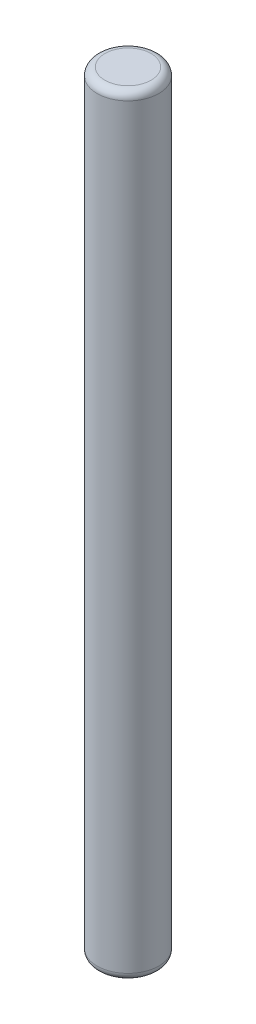
ISO-10303-21;
HEADER;
FILE_DESCRIPTION(('STEP AP214'),'2;1');
FILE_NAME('part.step','',(''),(''),'','','');
FILE_SCHEMA(('AUTOMOTIVE_DESIGN { 1 0 10303 214 1 1 1 1 }'));
ENDSEC;
DATA;
#1=APPLICATION_CONTEXT('core data for automotive mechanical design processes');
#2=APPLICATION_PROTOCOL_DEFINITION('international standard','automotive_design',2000,#1);
#3=PRODUCT_CONTEXT('',#1,'mechanical');
#4=PRODUCT('Part','Part','',(#3));
#5=PRODUCT_RELATED_PRODUCT_CATEGORY('part','',(#4));
#6=PRODUCT_DEFINITION_FORMATION('','',#4);
#7=PRODUCT_DEFINITION_CONTEXT('part definition',#1,'design');
#8=PRODUCT_DEFINITION('design','',#6,#7);
#9=PRODUCT_DEFINITION_SHAPE('','',#8);
#10=(LENGTH_UNIT() NAMED_UNIT(*) SI_UNIT(.MILLI.,.METRE.));
#11=(NAMED_UNIT(*) PLANE_ANGLE_UNIT() SI_UNIT($,.RADIAN.));
#12=(NAMED_UNIT(*) SI_UNIT($,.STERADIAN.) SOLID_ANGLE_UNIT());
#13=UNCERTAINTY_MEASURE_WITH_UNIT(LENGTH_MEASURE(1.E-05),#10,'distance_accuracy_value','');
#14=(GEOMETRIC_REPRESENTATION_CONTEXT(3) GLOBAL_UNCERTAINTY_ASSIGNED_CONTEXT((#13)) GLOBAL_UNIT_ASSIGNED_CONTEXT((#10,
#11,#12)) REPRESENTATION_CONTEXT('',''));
#15=CARTESIAN_POINT('',(0.,0.,0.));
#16=DIRECTION('',(0.,0.,1.));
#17=DIRECTION('',(1.,0.,0.));
#18=AXIS2_PLACEMENT_3D('',#15,#16,#17);
#19=CARTESIAN_POINT('',(0.,50.,0.));
#20=DIRECTION('',(0.,-1.,0.));
#21=DIRECTION('',(0.,0.,-1.));
#22=AXIS2_PLACEMENT_3D('',#19,#20,#21);
#23=CYLINDRICAL_SURFACE('',#22,2.);
#24=CARTESIAN_POINT('',(0.,0.5,0.));
#25=DIRECTION('',(0.,1.,0.));
#26=DIRECTION('',(0.,0.,1.));
#27=AXIS2_PLACEMENT_3D('',#24,#25,#26);
#28=CIRCLE('',#27,2.);
#29=CARTESIAN_POINT('',(0.,0.5,2.));
#30=VERTEX_POINT('',#29);
#31=EDGE_CURVE('E48',#30,#30,#28,.T.);
#32=ORIENTED_EDGE('',*,*,#31,.T.);
#33=EDGE_LOOP('',(#32));
#34=FACE_BOUND('',#33,.T.);
#35=CARTESIAN_POINT('',(0.,49.5,0.));
#36=DIRECTION('',(0.,1.,0.));
#37=DIRECTION('',(0.,0.,1.));
#38=AXIS2_PLACEMENT_3D('',#35,#36,#37);
#39=CIRCLE('',#38,2.);
#40=CARTESIAN_POINT('',(0.,49.5,2.));
#41=VERTEX_POINT('',#40);
#42=EDGE_CURVE('E52',#41,#41,#39,.F.);
#43=ORIENTED_EDGE('',*,*,#42,.T.);
#44=EDGE_LOOP('',(#43));
#45=FACE_BOUND('',#44,.T.);
#46=ADVANCED_FACE('F37',(#34,#45),#23,.T.);
#47=CARTESIAN_POINT('',(0.,50.,0.));
#48=DIRECTION('',(0.,1.,0.));
#49=DIRECTION('',(0.,0.,1.));
#50=AXIS2_PLACEMENT_3D('',#47,#48,#49);
#51=PLANE('',#50);
#52=CARTESIAN_POINT('',(0.,50.,0.));
#53=DIRECTION('',(0.,1.,0.));
#54=DIRECTION('',(0.,0.,1.));
#55=AXIS2_PLACEMENT_3D('',#52,#53,#54);
#56=CIRCLE('',#55,1.5);
#57=CARTESIAN_POINT('',(0.,50.,1.5));
#58=VERTEX_POINT('',#57);
#59=EDGE_CURVE('E10',#58,#58,#56,.T.);
#60=ORIENTED_EDGE('',*,*,#59,.T.);
#61=EDGE_LOOP('',(#60));
#62=FACE_BOUND('',#61,.T.);
#63=ADVANCED_FACE('F68',(#62),#51,.T.);
#64=CARTESIAN_POINT('',(0.,0.,0.));
#65=DIRECTION('',(0.,1.,0.));
#66=DIRECTION('',(0.,0.,1.));
#67=AXIS2_PLACEMENT_3D('',#64,#65,#66);
#68=PLANE('',#67);
#69=CARTESIAN_POINT('',(0.,0.,0.));
#70=DIRECTION('',(0.,1.,0.));
#71=DIRECTION('',(0.,0.,1.));
#72=AXIS2_PLACEMENT_3D('',#69,#70,#71);
#73=CIRCLE('',#72,1.5);
#74=CARTESIAN_POINT('',(0.,0.,1.5));
#75=VERTEX_POINT('',#74);
#76=EDGE_CURVE('E44',#75,#75,#73,.F.);
#77=ORIENTED_EDGE('',*,*,#76,.T.);
#78=EDGE_LOOP('',(#77));
#79=FACE_BOUND('',#78,.T.);
#80=ADVANCED_FACE('F65',(#79),#68,.F.);
#81=CARTESIAN_POINT('',(0.,0.5,0.));
#82=DIRECTION('',(0.,1.,0.));
#83=DIRECTION('',(0.,0.,1.));
#84=AXIS2_PLACEMENT_3D('',#81,#82,#83);
#85=TOROIDAL_SURFACE('',#84,1.5,0.5);
#86=ORIENTED_EDGE('',*,*,#76,.F.);
#87=EDGE_LOOP('',(#86));
#88=FACE_BOUND('',#87,.T.);
#89=ORIENTED_EDGE('',*,*,#31,.F.);
#90=EDGE_LOOP('',(#89));
#91=FACE_BOUND('',#90,.T.);
#92=ADVANCED_FACE('F61',(#88,#91),#85,.T.);
#93=CARTESIAN_POINT('',(0.,49.5,0.));
#94=DIRECTION('',(0.,1.,0.));
#95=DIRECTION('',(0.,0.,1.));
#96=AXIS2_PLACEMENT_3D('',#93,#94,#95);
#97=TOROIDAL_SURFACE('',#96,1.5,0.5);
#98=ORIENTED_EDGE('',*,*,#42,.F.);
#99=EDGE_LOOP('',(#98));
#100=FACE_BOUND('',#99,.T.);
#101=ORIENTED_EDGE('',*,*,#59,.F.);
#102=EDGE_LOOP('',(#101));
#103=FACE_BOUND('',#102,.T.);
#104=ADVANCED_FACE('F39',(#100,#103),#97,.T.);
#105=CLOSED_SHELL('',(#46,#63,#80,#92,#104));
#106=MANIFOLD_SOLID_BREP('B2',#105);
#107=ADVANCED_BREP_SHAPE_REPRESENTATION('',(#18,#106),#14);
#108=SHAPE_DEFINITION_REPRESENTATION(#9,#107);
ENDSEC;
END-ISO-10303-21;
